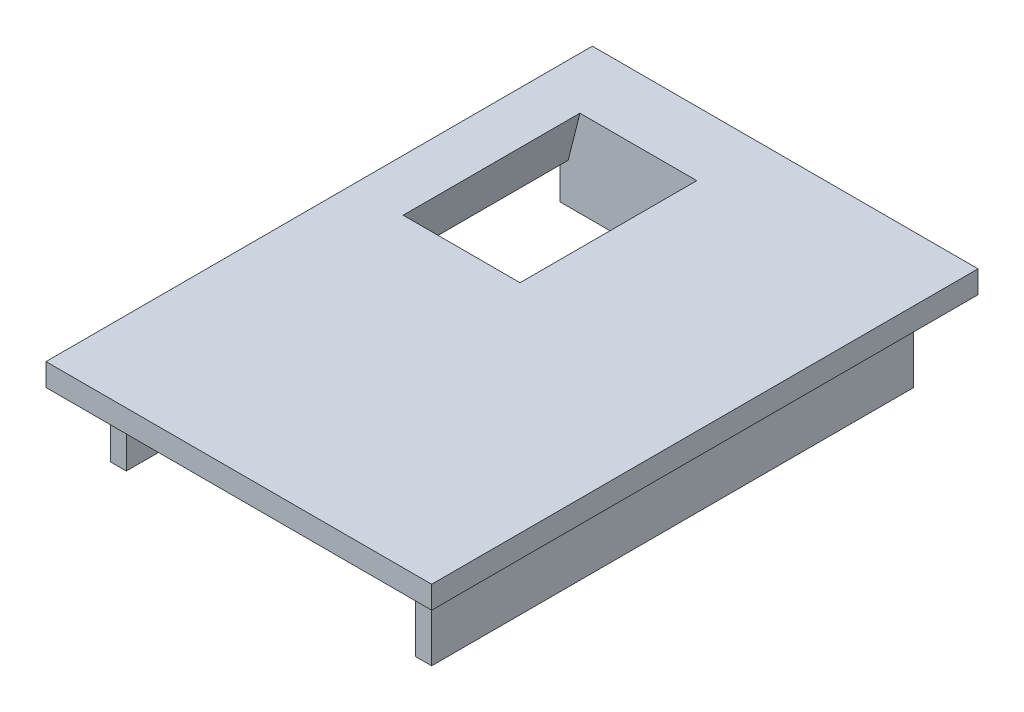
ISO-10303-21;
HEADER;
FILE_DESCRIPTION(('STEP AP214'),'2;1');
FILE_NAME('part.step','',(''),(''),'','','');
FILE_SCHEMA(('AUTOMOTIVE_DESIGN { 1 0 10303 214 1 1 1 1 }'));
ENDSEC;
DATA;
#1=APPLICATION_CONTEXT('core data for automotive mechanical design processes');
#2=APPLICATION_PROTOCOL_DEFINITION('international standard','automotive_design',2000,#1);
#3=PRODUCT_CONTEXT('',#1,'mechanical');
#4=PRODUCT('Part','Part','',(#3));
#5=PRODUCT_RELATED_PRODUCT_CATEGORY('part','',(#4));
#6=PRODUCT_DEFINITION_FORMATION('','',#4);
#7=PRODUCT_DEFINITION_CONTEXT('part definition',#1,'design');
#8=PRODUCT_DEFINITION('design','',#6,#7);
#9=PRODUCT_DEFINITION_SHAPE('','',#8);
#10=(LENGTH_UNIT() NAMED_UNIT(*) SI_UNIT(.MILLI.,.METRE.));
#11=(NAMED_UNIT(*) PLANE_ANGLE_UNIT() SI_UNIT($,.RADIAN.));
#12=(NAMED_UNIT(*) SI_UNIT($,.STERADIAN.) SOLID_ANGLE_UNIT());
#13=UNCERTAINTY_MEASURE_WITH_UNIT(LENGTH_MEASURE(1.E-05),#10,'distance_accuracy_value','');
#14=(GEOMETRIC_REPRESENTATION_CONTEXT(3) GLOBAL_UNCERTAINTY_ASSIGNED_CONTEXT((#13)) GLOBAL_UNIT_ASSIGNED_CONTEXT((#10,
#11,#12)) REPRESENTATION_CONTEXT('',''));
#15=CARTESIAN_POINT('',(0.,0.,0.));
#16=DIRECTION('',(0.,0.,1.));
#17=DIRECTION('',(1.,0.,0.));
#18=AXIS2_PLACEMENT_3D('',#15,#16,#17);
#19=CARTESIAN_POINT('',(0.,-4.,0.));
#20=DIRECTION('',(0.,1.,0.));
#21=DIRECTION('',(0.,0.,1.));
#22=AXIS2_PLACEMENT_3D('',#19,#20,#21);
#23=PLANE('',#22);
#24=DIRECTION('',(0.,0.,-1.));
#25=VECTOR('',#24,1.);
#26=CARTESIAN_POINT('',(8.,-4.,-15.));
#27=LINE('',#26,#25);
#28=CARTESIAN_POINT('',(8.,-4.,-13.));
#29=VERTEX_POINT('',#28);
#30=CARTESIAN_POINT('',(8.,-4.,-15.));
#31=VERTEX_POINT('',#30);
#32=EDGE_CURVE('E222',#29,#31,#27,.T.);
#33=ORIENTED_EDGE('',*,*,#32,.F.);
#34=DIRECTION('',(1.,0.,0.));
#35=VECTOR('',#34,1.);
#36=CARTESIAN_POINT('',(8.00000000000001,-4.,-13.));
#37=LINE('',#36,#35);
#38=CARTESIAN_POINT('',(-10.,-4.,-13.));
#39=VERTEX_POINT('',#38);
#40=EDGE_CURVE('E305',#39,#29,#37,.T.);
#41=ORIENTED_EDGE('',*,*,#40,.F.);
#42=DIRECTION('',(0.,0.,-1.));
#43=VECTOR('',#42,1.);
#44=CARTESIAN_POINT('',(-10.,-4.,-15.));
#45=LINE('',#44,#43);
#46=CARTESIAN_POINT('',(-10.,-4.,-15.));
#47=VERTEX_POINT('',#46);
#48=EDGE_CURVE('E331',#39,#47,#45,.T.);
#49=ORIENTED_EDGE('',*,*,#48,.T.);
#50=DIRECTION('',(1.,0.,0.));
#51=VECTOR('',#50,1.);
#52=CARTESIAN_POINT('',(-10.,-4.,-15.));
#53=LINE('',#52,#51);
#54=EDGE_CURVE('E336',#47,#31,#53,.T.);
#55=ORIENTED_EDGE('',*,*,#54,.T.);
#56=EDGE_LOOP('',(#33,#41,#49,#55));
#57=FACE_BOUND('',#56,.T.);
#58=ADVANCED_FACE('F35',(#57),#23,.F.);
#59=CARTESIAN_POINT('',(-10.,-4.,15.));
#60=VERTEX_POINT('',#59);
#61=CARTESIAN_POINT('',(-10.,-4.,-2.));
#62=VERTEX_POINT('',#61);
#63=EDGE_CURVE('E333',#60,#62,#45,.T.);
#64=ORIENTED_EDGE('',*,*,#63,.T.);
#65=DIRECTION('',(-1.,0.,0.));
#66=VECTOR('',#65,1.);
#67=CARTESIAN_POINT('',(3.28051417267847,-4.,-2.));
#68=LINE('',#67,#66);
#69=CARTESIAN_POINT('',(-8.,-4.,-2.));
#70=VERTEX_POINT('',#69);
#71=EDGE_CURVE('E255',#70,#62,#68,.T.);
#72=ORIENTED_EDGE('',*,*,#71,.F.);
#73=DIRECTION('',(0.,0.,-1.));
#74=VECTOR('',#73,1.);
#75=CARTESIAN_POINT('',(-8.,-4.,-13.));
#76=LINE('',#75,#74);
#77=CARTESIAN_POINT('',(-8.,-4.,13.));
#78=VERTEX_POINT('',#77);
#79=EDGE_CURVE('E303',#78,#70,#76,.T.);
#80=ORIENTED_EDGE('',*,*,#79,.F.);
#81=DIRECTION('',(1.,0.,0.));
#82=VECTOR('',#81,1.);
#83=CARTESIAN_POINT('',(9.,-4.,13.));
#84=LINE('',#83,#82);
#85=CARTESIAN_POINT('',(-9.,-4.,13.));
#86=VERTEX_POINT('',#85);
#87=EDGE_CURVE('E262',#86,#78,#84,.T.);
#88=ORIENTED_EDGE('',*,*,#87,.F.);
#89=DIRECTION('',(0.,0.,1.));
#90=VECTOR('',#89,1.);
#91=CARTESIAN_POINT('',(-9.,-4.,-5.24828759089465));
#92=LINE('',#91,#90);
#93=CARTESIAN_POINT('',(-9.,-4.,15.));
#94=VERTEX_POINT('',#93);
#95=EDGE_CURVE('E269',#86,#94,#92,.T.);
#96=ORIENTED_EDGE('',*,*,#95,.T.);
#97=DIRECTION('',(-1.,0.,0.));
#98=VECTOR('',#97,1.);
#99=CARTESIAN_POINT('',(-10.,-4.,15.));
#100=LINE('',#99,#98);
#101=EDGE_CURVE('E329',#94,#60,#100,.T.);
#102=ORIENTED_EDGE('',*,*,#101,.T.);
#103=EDGE_LOOP('',(#64,#72,#80,#88,#96,#102));
#104=FACE_BOUND('',#103,.T.);
#105=ADVANCED_FACE('F416',(#104),#23,.F.);
#106=CARTESIAN_POINT('',(0.,0.,0.));
#107=DIRECTION('',(0.,-1.,0.));
#108=DIRECTION('',(0.,0.,-1.));
#109=AXIS2_PLACEMENT_3D('',#106,#107,#108);
#110=PLANE('',#109);
#111=DIRECTION('',(0.,0.,-1.));
#112=VECTOR('',#111,1.);
#113=CARTESIAN_POINT('',(12.,0.,17.));
#114=LINE('',#113,#112);
#115=CARTESIAN_POINT('',(12.,0.,17.));
#116=VERTEX_POINT('',#115);
#117=CARTESIAN_POINT('',(12.,0.,-17.));
#118=VERTEX_POINT('',#117);
#119=EDGE_CURVE('E210',#116,#118,#114,.T.);
#120=ORIENTED_EDGE('',*,*,#119,.F.);
#121=DIRECTION('',(1.,0.,0.));
#122=VECTOR('',#121,1.);
#123=CARTESIAN_POINT('',(-12.,0.,17.));
#124=LINE('',#123,#122);
#125=CARTESIAN_POINT('',(-12.,0.,17.));
#126=VERTEX_POINT('',#125);
#127=EDGE_CURVE('E356',#126,#116,#124,.T.);
#128=ORIENTED_EDGE('',*,*,#127,.F.);
#129=DIRECTION('',(0.,0.,1.));
#130=VECTOR('',#129,1.);
#131=CARTESIAN_POINT('',(-12.,0.,17.));
#132=LINE('',#131,#130);
#133=CARTESIAN_POINT('',(-12.,0.,-17.));
#134=VERTEX_POINT('',#133);
#135=EDGE_CURVE('E367',#134,#126,#132,.T.);
#136=ORIENTED_EDGE('',*,*,#135,.F.);
#137=DIRECTION('',(-1.,0.,0.));
#138=VECTOR('',#137,1.);
#139=CARTESIAN_POINT('',(-12.,0.,-17.));
#140=LINE('',#139,#138);
#141=EDGE_CURVE('E365',#118,#134,#140,.T.);
#142=ORIENTED_EDGE('',*,*,#141,.F.);
#143=EDGE_LOOP('',(#120,#128,#136,#142));
#144=FACE_BOUND('',#143,.T.);
#145=DIRECTION('',(-1.,0.,0.));
#146=VECTOR('',#145,1.);
#147=CARTESIAN_POINT('',(-10.,0.,15.));
#148=LINE('',#147,#146);
#149=CARTESIAN_POINT('',(10.,0.,15.));
#150=VERTEX_POINT('',#149);
#151=CARTESIAN_POINT('',(-10.,0.,15.));
#152=VERTEX_POINT('',#151);
#153=EDGE_CURVE('E341',#150,#152,#148,.T.);
#154=ORIENTED_EDGE('',*,*,#153,.F.);
#155=DIRECTION('',(0.,0.,1.));
#156=VECTOR('',#155,1.);
#157=CARTESIAN_POINT('',(10.,0.,-15.));
#158=LINE('',#157,#156);
#159=CARTESIAN_POINT('',(10.,0.,-15.));
#160=VERTEX_POINT('',#159);
#161=EDGE_CURVE('E206',#160,#150,#158,.T.);
#162=ORIENTED_EDGE('',*,*,#161,.F.);
#163=DIRECTION('',(1.,0.,0.));
#164=VECTOR('',#163,1.);
#165=CARTESIAN_POINT('',(-10.,0.,-15.));
#166=LINE('',#165,#164);
#167=CARTESIAN_POINT('',(-10.,0.,-15.));
#168=VERTEX_POINT('',#167);
#169=EDGE_CURVE('E332',#168,#160,#166,.T.);
#170=ORIENTED_EDGE('',*,*,#169,.F.);
#171=DIRECTION('',(0.,0.,-1.));
#172=VECTOR('',#171,1.);
#173=CARTESIAN_POINT('',(-10.,0.,-15.));
#174=LINE('',#173,#172);
#175=EDGE_CURVE('E343',#152,#168,#174,.T.);
#176=ORIENTED_EDGE('',*,*,#175,.F.);
#177=EDGE_LOOP('',(#154,#162,#170,#176));
#178=FACE_BOUND('',#177,.T.);
#179=ADVANCED_FACE('F450',(#144,#178),#110,.T.);
#180=CARTESIAN_POINT('',(12.,1.4,17.));
#181=DIRECTION('',(-1.,0.,0.));
#182=DIRECTION('',(0.,0.,1.));
#183=AXIS2_PLACEMENT_3D('',#180,#181,#182);
#184=PLANE('',#183);
#185=ORIENTED_EDGE('',*,*,#119,.T.);
#186=DIRECTION('',(0.,-1.,0.));
#187=VECTOR('',#186,1.);
#188=CARTESIAN_POINT('',(12.,1.4,-17.));
#189=LINE('',#188,#187);
#190=CARTESIAN_POINT('',(12.,1.4,-17.));
#191=VERTEX_POINT('',#190);
#192=EDGE_CURVE('E378',#191,#118,#189,.T.);
#193=ORIENTED_EDGE('',*,*,#192,.F.);
#194=DIRECTION('',(0.,0.,-1.));
#195=VECTOR('',#194,1.);
#196=CARTESIAN_POINT('',(12.,1.4,17.));
#197=LINE('',#196,#195);
#198=CARTESIAN_POINT('',(12.,1.4,17.));
#199=VERTEX_POINT('',#198);
#200=EDGE_CURVE('E352',#199,#191,#197,.T.);
#201=ORIENTED_EDGE('',*,*,#200,.F.);
#202=DIRECTION('',(0.,-1.,0.));
#203=VECTOR('',#202,1.);
#204=CARTESIAN_POINT('',(12.,1.4,17.));
#205=LINE('',#204,#203);
#206=EDGE_CURVE('E362',#199,#116,#205,.T.);
#207=ORIENTED_EDGE('',*,*,#206,.T.);
#208=EDGE_LOOP('',(#185,#193,#201,#207));
#209=FACE_BOUND('',#208,.T.);
#210=ADVANCED_FACE('F503',(#209),#184,.F.);
#211=CARTESIAN_POINT('',(-12.,1.4,-17.));
#212=DIRECTION('',(0.,0.,1.));
#213=DIRECTION('',(1.,0.,0.));
#214=AXIS2_PLACEMENT_3D('',#211,#212,#213);
#215=PLANE('',#214);
#216=ORIENTED_EDGE('',*,*,#141,.T.);
#217=DIRECTION('',(0.,-1.,0.));
#218=VECTOR('',#217,1.);
#219=CARTESIAN_POINT('',(-12.,1.4,-17.));
#220=LINE('',#219,#218);
#221=CARTESIAN_POINT('',(-12.,1.4,-17.));
#222=VERTEX_POINT('',#221);
#223=EDGE_CURVE('E375',#222,#134,#220,.T.);
#224=ORIENTED_EDGE('',*,*,#223,.F.);
#225=DIRECTION('',(-1.,0.,0.));
#226=VECTOR('',#225,1.);
#227=CARTESIAN_POINT('',(-12.,1.4,-17.));
#228=LINE('',#227,#226);
#229=EDGE_CURVE('E355',#191,#222,#228,.T.);
#230=ORIENTED_EDGE('',*,*,#229,.F.);
#231=ORIENTED_EDGE('',*,*,#192,.T.);
#232=EDGE_LOOP('',(#216,#224,#230,#231));
#233=FACE_BOUND('',#232,.T.);
#234=ADVANCED_FACE('F500',(#233),#215,.F.);
#235=CARTESIAN_POINT('',(-12.,1.4,17.));
#236=DIRECTION('',(1.,0.,0.));
#237=DIRECTION('',(0.,0.,-1.));
#238=AXIS2_PLACEMENT_3D('',#235,#236,#237);
#239=PLANE('',#238);
#240=ORIENTED_EDGE('',*,*,#135,.T.);
#241=DIRECTION('',(0.,-1.,0.));
#242=VECTOR('',#241,1.);
#243=CARTESIAN_POINT('',(-12.,1.4,17.));
#244=LINE('',#243,#242);
#245=CARTESIAN_POINT('',(-12.,1.4,17.));
#246=VERTEX_POINT('',#245);
#247=EDGE_CURVE('E372',#246,#126,#244,.T.);
#248=ORIENTED_EDGE('',*,*,#247,.F.);
#249=DIRECTION('',(0.,0.,1.));
#250=VECTOR('',#249,1.);
#251=CARTESIAN_POINT('',(-12.,1.4,17.));
#252=LINE('',#251,#250);
#253=EDGE_CURVE('E358',#222,#246,#252,.T.);
#254=ORIENTED_EDGE('',*,*,#253,.F.);
#255=ORIENTED_EDGE('',*,*,#223,.T.);
#256=EDGE_LOOP('',(#240,#248,#254,#255));
#257=FACE_BOUND('',#256,.T.);
#258=ADVANCED_FACE('F496',(#257),#239,.F.);
#259=CARTESIAN_POINT('',(-12.,1.4,17.));
#260=DIRECTION('',(0.,0.,-1.));
#261=DIRECTION('',(-1.,0.,0.));
#262=AXIS2_PLACEMENT_3D('',#259,#260,#261);
#263=PLANE('',#262);
#264=ORIENTED_EDGE('',*,*,#127,.T.);
#265=ORIENTED_EDGE('',*,*,#206,.F.);
#266=DIRECTION('',(1.,0.,0.));
#267=VECTOR('',#266,1.);
#268=CARTESIAN_POINT('',(-12.,1.4,17.));
#269=LINE('',#268,#267);
#270=EDGE_CURVE('E360',#246,#199,#269,.T.);
#271=ORIENTED_EDGE('',*,*,#270,.F.);
#272=ORIENTED_EDGE('',*,*,#247,.T.);
#273=EDGE_LOOP('',(#264,#265,#271,#272));
#274=FACE_BOUND('',#273,.T.);
#275=ADVANCED_FACE('F491',(#274),#263,.F.);
#276=CARTESIAN_POINT('',(0.,1.4,0.));
#277=DIRECTION('',(0.,-1.,0.));
#278=DIRECTION('',(0.,0.,-1.));
#279=AXIS2_PLACEMENT_3D('',#276,#277,#278);
#280=PLANE('',#279);
#281=DIRECTION('',(0.,0.,-1.));
#282=VECTOR('',#281,1.);
#283=CARTESIAN_POINT('',(-8.77500000000003,1.4,-13.));
#284=LINE('',#283,#282);
#285=CARTESIAN_POINT('',(-8.77500000000003,1.4,-2.00000000000001));
#286=VERTEX_POINT('',#285);
#287=CARTESIAN_POINT('',(-8.77500000000003,1.4,-13.));
#288=VERTEX_POINT('',#287);
#289=EDGE_CURVE('E384',#286,#288,#284,.T.);
#290=ORIENTED_EDGE('',*,*,#289,.T.);
#291=DIRECTION('',(1.,0.,0.));
#292=VECTOR('',#291,1.);
#293=CARTESIAN_POINT('',(-1.5,1.4,-13.));
#294=LINE('',#293,#292);
#295=CARTESIAN_POINT('',(-1.5,1.4,-13.));
#296=VERTEX_POINT('',#295);
#297=EDGE_CURVE('E283',#288,#296,#294,.T.);
#298=ORIENTED_EDGE('',*,*,#297,.T.);
#299=DIRECTION('',(0.,0.,1.));
#300=VECTOR('',#299,1.);
#301=CARTESIAN_POINT('',(-1.5,1.4,-13.));
#302=LINE('',#301,#300);
#303=CARTESIAN_POINT('',(-1.5,1.4,-2.00000000000001));
#304=VERTEX_POINT('',#303);
#305=EDGE_CURVE('E286',#296,#304,#302,.T.);
#306=ORIENTED_EDGE('',*,*,#305,.T.);
#307=DIRECTION('',(-1.,0.,0.));
#308=VECTOR('',#307,1.);
#309=CARTESIAN_POINT('',(-1.5,1.4,-2.00000000000001));
#310=LINE('',#309,#308);
#311=CARTESIAN_POINT('',(-8.,1.4,-2.00000000000001));
#312=VERTEX_POINT('',#311);
#313=EDGE_CURVE('E290',#304,#312,#310,.T.);
#314=ORIENTED_EDGE('',*,*,#313,.T.);
#315=DIRECTION('',(-1.,0.,0.));
#316=VECTOR('',#315,1.);
#317=CARTESIAN_POINT('',(0.,1.4,-2.));
#318=LINE('',#317,#316);
#319=EDGE_CURVE('E50',#312,#286,#318,.T.);
#320=ORIENTED_EDGE('',*,*,#319,.T.);
#321=EDGE_LOOP('',(#290,#298,#306,#314,#320));
#322=FACE_BOUND('',#321,.T.);
#323=ORIENTED_EDGE('',*,*,#200,.T.);
#324=ORIENTED_EDGE('',*,*,#229,.T.);
#325=ORIENTED_EDGE('',*,*,#253,.T.);
#326=ORIENTED_EDGE('',*,*,#270,.T.);
#327=EDGE_LOOP('',(#323,#324,#325,#326));
#328=FACE_BOUND('',#327,.T.);
#329=ADVANCED_FACE('F405',(#322,#328),#280,.F.);
#330=CARTESIAN_POINT('',(10.,-4.,-15.));
#331=DIRECTION('',(-1.,0.,0.));
#332=DIRECTION('',(0.,0.,1.));
#333=AXIS2_PLACEMENT_3D('',#330,#331,#332);
#334=PLANE('',#333);
#335=ORIENTED_EDGE('',*,*,#161,.T.);
#336=DIRECTION('',(0.,1.,0.));
#337=VECTOR('',#336,1.);
#338=CARTESIAN_POINT('',(10.,-4.,15.));
#339=LINE('',#338,#337);
#340=CARTESIAN_POINT('',(10.,-5.,15.));
#341=VERTEX_POINT('',#340);
#342=EDGE_CURVE('E200',#341,#150,#339,.T.);
#343=ORIENTED_EDGE('',*,*,#342,.F.);
#344=DIRECTION('',(0.,0.,1.));
#345=VECTOR('',#344,1.);
#346=CARTESIAN_POINT('',(10.,-5.,-15.));
#347=LINE('',#346,#345);
#348=CARTESIAN_POINT('',(10.,-5.,-15.));
#349=VERTEX_POINT('',#348);
#350=EDGE_CURVE('E204',#349,#341,#347,.T.);
#351=ORIENTED_EDGE('',*,*,#350,.F.);
#352=DIRECTION('',(0.,1.,0.));
#353=VECTOR('',#352,1.);
#354=CARTESIAN_POINT('',(10.,-4.,-15.));
#355=LINE('',#354,#353);
#356=EDGE_CURVE('E339',#349,#160,#355,.T.);
#357=ORIENTED_EDGE('',*,*,#356,.T.);
#358=EDGE_LOOP('',(#335,#343,#351,#357));
#359=FACE_BOUND('',#358,.T.);
#360=ADVANCED_FACE('F202',(#359),#334,.F.);
#361=CARTESIAN_POINT('',(-10.,-4.,15.));
#362=DIRECTION('',(0.,0.,-1.));
#363=DIRECTION('',(-1.,0.,0.));
#364=AXIS2_PLACEMENT_3D('',#361,#362,#363);
#365=PLANE('',#364);
#366=DIRECTION('',(-1.,0.,0.));
#367=VECTOR('',#366,1.);
#368=CARTESIAN_POINT('',(-9.,-1.,15.));
#369=LINE('',#368,#367);
#370=CARTESIAN_POINT('',(9.,-0.999999999999997,15.));
#371=VERTEX_POINT('',#370);
#372=CARTESIAN_POINT('',(-9.,-1.,15.));
#373=VERTEX_POINT('',#372);
#374=EDGE_CURVE('E259',#371,#373,#369,.T.);
#375=ORIENTED_EDGE('',*,*,#374,.F.);
#376=DIRECTION('',(0.,1.,0.));
#377=VECTOR('',#376,1.);
#378=CARTESIAN_POINT('',(9.,-0.999999999999997,15.));
#379=LINE('',#378,#377);
#380=CARTESIAN_POINT('',(9.,-5.,15.));
#381=VERTEX_POINT('',#380);
#382=EDGE_CURVE('E227',#381,#371,#379,.T.);
#383=ORIENTED_EDGE('',*,*,#382,.F.);
#384=DIRECTION('',(-1.,0.,0.));
#385=VECTOR('',#384,1.);
#386=CARTESIAN_POINT('',(10.,-5.,15.));
#387=LINE('',#386,#385);
#388=EDGE_CURVE('E218',#341,#381,#387,.T.);
#389=ORIENTED_EDGE('',*,*,#388,.F.);
#390=ORIENTED_EDGE('',*,*,#342,.T.);
#391=ORIENTED_EDGE('',*,*,#153,.T.);
#392=DIRECTION('',(0.,1.,0.));
#393=VECTOR('',#392,1.);
#394=CARTESIAN_POINT('',(-10.,-4.,15.));
#395=LINE('',#394,#393);
#396=EDGE_CURVE('E211',#60,#152,#395,.T.);
#397=ORIENTED_EDGE('',*,*,#396,.F.);
#398=ORIENTED_EDGE('',*,*,#101,.F.);
#399=DIRECTION('',(0.,-1.,0.));
#400=VECTOR('',#399,1.);
#401=CARTESIAN_POINT('',(-9.,-4.,15.));
#402=LINE('',#401,#400);
#403=EDGE_CURVE('E258',#373,#94,#402,.T.);
#404=ORIENTED_EDGE('',*,*,#403,.F.);
#405=EDGE_LOOP('',(#375,#383,#389,#390,#391,#397,#398,#404));
#406=FACE_BOUND('',#405,.T.);
#407=ADVANCED_FACE('F225',(#406),#365,.F.);
#408=CARTESIAN_POINT('',(-10.,-4.,-15.));
#409=DIRECTION('',(1.,0.,0.));
#410=DIRECTION('',(0.,0.,-1.));
#411=AXIS2_PLACEMENT_3D('',#408,#409,#410);
#412=PLANE('',#411);
#413=DIRECTION('',(0.,0.,-1.));
#414=VECTOR('',#413,1.);
#415=CARTESIAN_POINT('',(-10.,-1.5,-13.));
#416=LINE('',#415,#414);
#417=CARTESIAN_POINT('',(-10.,-1.5,-2.));
#418=VERTEX_POINT('',#417);
#419=CARTESIAN_POINT('',(-10.,-1.5,-13.));
#420=VERTEX_POINT('',#419);
#421=EDGE_CURVE('E246',#418,#420,#416,.T.);
#422=ORIENTED_EDGE('',*,*,#421,.F.);
#423=DIRECTION('',(0.,1.,0.));
#424=VECTOR('',#423,1.);
#425=CARTESIAN_POINT('',(-10.,-1.5,-2.));
#426=LINE('',#425,#424);
#427=EDGE_CURVE('E242',#62,#418,#426,.T.);
#428=ORIENTED_EDGE('',*,*,#427,.F.);
#429=ORIENTED_EDGE('',*,*,#63,.F.);
#430=ORIENTED_EDGE('',*,*,#396,.T.);
#431=ORIENTED_EDGE('',*,*,#175,.T.);
#432=DIRECTION('',(0.,1.,0.));
#433=VECTOR('',#432,1.);
#434=CARTESIAN_POINT('',(-10.,-4.,-15.));
#435=LINE('',#434,#433);
#436=EDGE_CURVE('E348',#47,#168,#435,.T.);
#437=ORIENTED_EDGE('',*,*,#436,.F.);
#438=ORIENTED_EDGE('',*,*,#48,.F.);
#439=DIRECTION('',(0.,-1.,0.));
#440=VECTOR('',#439,1.);
#441=CARTESIAN_POINT('',(-10.,-4.,-13.));
#442=LINE('',#441,#440);
#443=EDGE_CURVE('E243',#420,#39,#442,.T.);
#444=ORIENTED_EDGE('',*,*,#443,.F.);
#445=EDGE_LOOP('',(#422,#428,#429,#430,#431,#437,#438,#444));
#446=FACE_BOUND('',#445,.T.);
#447=ADVANCED_FACE('F455',(#446),#412,.F.);
#448=CARTESIAN_POINT('',(-10.,-4.,-15.));
#449=DIRECTION('',(0.,0.,1.));
#450=DIRECTION('',(1.,0.,0.));
#451=AXIS2_PLACEMENT_3D('',#448,#449,#450);
#452=PLANE('',#451);
#453=ORIENTED_EDGE('',*,*,#169,.T.);
#454=ORIENTED_EDGE('',*,*,#356,.F.);
#455=DIRECTION('',(1.,0.,0.));
#456=VECTOR('',#455,1.);
#457=CARTESIAN_POINT('',(10.,-5.,-15.));
#458=LINE('',#457,#456);
#459=CARTESIAN_POINT('',(8.,-5.,-15.));
#460=VERTEX_POINT('',#459);
#461=EDGE_CURVE('E221',#460,#349,#458,.T.);
#462=ORIENTED_EDGE('',*,*,#461,.F.);
#463=DIRECTION('',(0.,1.,0.));
#464=VECTOR('',#463,1.);
#465=CARTESIAN_POINT('',(8.,-5.,-15.));
#466=LINE('',#465,#464);
#467=EDGE_CURVE('E238',#460,#31,#466,.T.);
#468=ORIENTED_EDGE('',*,*,#467,.T.);
#469=ORIENTED_EDGE('',*,*,#54,.F.);
#470=ORIENTED_EDGE('',*,*,#436,.T.);
#471=EDGE_LOOP('',(#453,#454,#462,#468,#469,#470));
#472=FACE_BOUND('',#471,.T.);
#473=ADVANCED_FACE('F447',(#472),#452,.F.);
#474=CARTESIAN_POINT('',(-8.,-4.,-13.));
#475=DIRECTION('',(1.,0.,0.));
#476=DIRECTION('',(0.,0.,-1.));
#477=AXIS2_PLACEMENT_3D('',#474,#475,#476);
#478=PLANE('',#477);
#479=DIRECTION('',(0.,1.,0.));
#480=VECTOR('',#479,1.);
#481=CARTESIAN_POINT('',(-8.,-1.5,-2.));
#482=LINE('',#481,#480);
#483=CARTESIAN_POINT('',(-8.,0.,-2.00000000000001));
#484=VERTEX_POINT('',#483);
#485=EDGE_CURVE('E58',#70,#484,#482,.T.);
#486=ORIENTED_EDGE('',*,*,#485,.T.);
#487=DIRECTION('',(0.,0.,-1.));
#488=VECTOR('',#487,1.);
#489=CARTESIAN_POINT('',(-8.,0.,-13.));
#490=LINE('',#489,#488);
#491=CARTESIAN_POINT('',(-8.,0.,13.));
#492=VERTEX_POINT('',#491);
#493=EDGE_CURVE('E298',#492,#484,#490,.T.);
#494=ORIENTED_EDGE('',*,*,#493,.F.);
#495=DIRECTION('',(0.,1.,0.));
#496=VECTOR('',#495,1.);
#497=CARTESIAN_POINT('',(-8.,-4.,13.));
#498=LINE('',#497,#496);
#499=CARTESIAN_POINT('',(-8.,-0.999999999999998,13.));
#500=VERTEX_POINT('',#499);
#501=EDGE_CURVE('E309',#500,#492,#498,.T.);
#502=ORIENTED_EDGE('',*,*,#501,.F.);
#503=EDGE_CURVE('E319',#78,#500,#498,.T.);
#504=ORIENTED_EDGE('',*,*,#503,.F.);
#505=ORIENTED_EDGE('',*,*,#79,.T.);
#506=EDGE_LOOP('',(#486,#494,#502,#504,#505));
#507=FACE_BOUND('',#506,.T.);
#508=ADVANCED_FACE('F420',(#507),#478,.T.);
#509=CARTESIAN_POINT('',(8.00000000000001,-4.,-13.));
#510=DIRECTION('',(0.,0.,1.));
#511=DIRECTION('',(1.,0.,0.));
#512=AXIS2_PLACEMENT_3D('',#509,#510,#511);
#513=PLANE('',#512);
#514=DIRECTION('',(1.,0.,0.));
#515=VECTOR('',#514,1.);
#516=CARTESIAN_POINT('',(8.00000000000001,0.,-13.));
#517=LINE('',#516,#515);
#518=CARTESIAN_POINT('',(-1.5,0.,-13.));
#519=VERTEX_POINT('',#518);
#520=CARTESIAN_POINT('',(8.00000000000001,0.,-13.));
#521=VERTEX_POINT('',#520);
#522=EDGE_CURVE('E312',#519,#521,#517,.T.);
#523=ORIENTED_EDGE('',*,*,#522,.F.);
#524=DIRECTION('',(0.,-1.,0.));
#525=VECTOR('',#524,1.);
#526=CARTESIAN_POINT('',(-1.5,1.4,-13.));
#527=LINE('',#526,#525);
#528=EDGE_CURVE('E292',#296,#519,#527,.T.);
#529=ORIENTED_EDGE('',*,*,#528,.F.);
#530=ORIENTED_EDGE('',*,*,#297,.F.);
#531=DIRECTION('',(-0.242535625036339,-0.97014250014533,0.));
#532=VECTOR('',#531,1.);
#533=CARTESIAN_POINT('',(-8.,4.50000000000001,-13.));
#534=LINE('',#533,#532);
#535=CARTESIAN_POINT('',(-9.50000000000005,-1.5,-13.));
#536=VERTEX_POINT('',#535);
#537=EDGE_CURVE('E44',#288,#536,#534,.T.);
#538=ORIENTED_EDGE('',*,*,#537,.T.);
#539=DIRECTION('',(-1.,0.,0.));
#540=VECTOR('',#539,1.);
#541=CARTESIAN_POINT('',(3.28051417267847,-1.5,-13.));
#542=LINE('',#541,#540);
#543=EDGE_CURVE('E253',#536,#420,#542,.T.);
#544=ORIENTED_EDGE('',*,*,#543,.T.);
#545=ORIENTED_EDGE('',*,*,#443,.T.);
#546=ORIENTED_EDGE('',*,*,#40,.T.);
#547=DIRECTION('',(0.,1.,0.));
#548=VECTOR('',#547,1.);
#549=CARTESIAN_POINT('',(8.00000000000001,-4.,-13.));
#550=LINE('',#549,#548);
#551=EDGE_CURVE('E326',#29,#521,#550,.T.);
#552=ORIENTED_EDGE('',*,*,#551,.T.);
#553=EDGE_LOOP('',(#523,#529,#530,#538,#544,#545,#546,#552));
#554=FACE_BOUND('',#553,.T.);
#555=ADVANCED_FACE('F393',(#554),#513,.T.);
#556=CARTESIAN_POINT('',(8.,-4.,13.));
#557=DIRECTION('',(-1.,0.,0.));
#558=DIRECTION('',(0.,0.,1.));
#559=AXIS2_PLACEMENT_3D('',#556,#557,#558);
#560=PLANE('',#559);
#561=DIRECTION('',(0.,0.,1.));
#562=VECTOR('',#561,1.);
#563=CARTESIAN_POINT('',(8.,0.,13.));
#564=LINE('',#563,#562);
#565=CARTESIAN_POINT('',(8.,0.,13.));
#566=VERTEX_POINT('',#565);
#567=EDGE_CURVE('E314',#521,#566,#564,.T.);
#568=ORIENTED_EDGE('',*,*,#567,.F.);
#569=ORIENTED_EDGE('',*,*,#551,.F.);
#570=ORIENTED_EDGE('',*,*,#32,.T.);
#571=ORIENTED_EDGE('',*,*,#467,.F.);
#572=DIRECTION('',(0.,0.,-1.));
#573=VECTOR('',#572,1.);
#574=CARTESIAN_POINT('',(8.,-5.,-15.));
#575=LINE('',#574,#573);
#576=CARTESIAN_POINT('',(8.,-5.,13.));
#577=VERTEX_POINT('',#576);
#578=EDGE_CURVE('E235',#577,#460,#575,.T.);
#579=ORIENTED_EDGE('',*,*,#578,.F.);
#580=DIRECTION('',(0.,1.,0.));
#581=VECTOR('',#580,1.);
#582=CARTESIAN_POINT('',(8.,-4.,13.));
#583=LINE('',#582,#581);
#584=CARTESIAN_POINT('',(8.,-0.999999999999997,13.));
#585=VERTEX_POINT('',#584);
#586=EDGE_CURVE('E323',#577,#585,#583,.T.);
#587=ORIENTED_EDGE('',*,*,#586,.T.);
#588=EDGE_CURVE('E322',#585,#566,#583,.T.);
#589=ORIENTED_EDGE('',*,*,#588,.T.);
#590=EDGE_LOOP('',(#568,#569,#570,#571,#579,#587,#589));
#591=FACE_BOUND('',#590,.T.);
#592=ADVANCED_FACE('F443',(#591),#560,.T.);
#593=CARTESIAN_POINT('',(-8.,-4.,13.));
#594=DIRECTION('',(0.,0.,-1.));
#595=DIRECTION('',(-1.,0.,0.));
#596=AXIS2_PLACEMENT_3D('',#593,#594,#595);
#597=PLANE('',#596);
#598=DIRECTION('',(1.,0.,0.));
#599=VECTOR('',#598,1.);
#600=CARTESIAN_POINT('',(-8.,-1.,13.));
#601=LINE('',#600,#599);
#602=EDGE_CURVE('E381',#500,#585,#601,.T.);
#603=ORIENTED_EDGE('',*,*,#602,.F.);
#604=ORIENTED_EDGE('',*,*,#501,.T.);
#605=DIRECTION('',(-1.,0.,0.));
#606=VECTOR('',#605,1.);
#607=CARTESIAN_POINT('',(-8.,0.,13.));
#608=LINE('',#607,#606);
#609=EDGE_CURVE('E306',#566,#492,#608,.T.);
#610=ORIENTED_EDGE('',*,*,#609,.F.);
#611=ORIENTED_EDGE('',*,*,#588,.F.);
#612=EDGE_LOOP('',(#603,#604,#610,#611));
#613=FACE_BOUND('',#612,.T.);
#614=ADVANCED_FACE('F428',(#613),#597,.T.);
#615=DIRECTION('',(0.,0.,1.));
#616=VECTOR('',#615,1.);
#617=CARTESIAN_POINT('',(-1.5,0.,-13.));
#618=LINE('',#617,#616);
#619=CARTESIAN_POINT('',(-1.5,0.,-2.00000000000001));
#620=VERTEX_POINT('',#619);
#621=EDGE_CURVE('E282',#519,#620,#618,.T.);
#622=ORIENTED_EDGE('',*,*,#621,.F.);
#623=ORIENTED_EDGE('',*,*,#522,.T.);
#624=ORIENTED_EDGE('',*,*,#567,.T.);
#625=ORIENTED_EDGE('',*,*,#609,.T.);
#626=ORIENTED_EDGE('',*,*,#493,.T.);
#627=DIRECTION('',(-1.,0.,0.));
#628=VECTOR('',#627,1.);
#629=CARTESIAN_POINT('',(-1.5,0.,-2.00000000000001));
#630=LINE('',#629,#628);
#631=EDGE_CURVE('E287',#620,#484,#630,.T.);
#632=ORIENTED_EDGE('',*,*,#631,.F.);
#633=EDGE_LOOP('',(#622,#623,#624,#625,#626,#632));
#634=FACE_BOUND('',#633,.T.);
#635=ADVANCED_FACE('F461',(#634),#110,.T.);
#636=CARTESIAN_POINT('',(-1.5,1.4,-2.00000000000001));
#637=DIRECTION('',(0.,0.,1.));
#638=DIRECTION('',(1.,0.,0.));
#639=AXIS2_PLACEMENT_3D('',#636,#637,#638);
#640=PLANE('',#639);
#641=ORIENTED_EDGE('',*,*,#631,.T.);
#642=DIRECTION('',(0.,-1.,0.));
#643=VECTOR('',#642,1.);
#644=CARTESIAN_POINT('',(-8.,1.4,-2.00000000000001));
#645=LINE('',#644,#643);
#646=EDGE_CURVE('E296',#312,#484,#645,.T.);
#647=ORIENTED_EDGE('',*,*,#646,.F.);
#648=ORIENTED_EDGE('',*,*,#313,.F.);
#649=DIRECTION('',(0.,-1.,0.));
#650=VECTOR('',#649,1.);
#651=CARTESIAN_POINT('',(-1.5,1.4,-2.00000000000001));
#652=LINE('',#651,#650);
#653=EDGE_CURVE('E299',#304,#620,#652,.T.);
#654=ORIENTED_EDGE('',*,*,#653,.T.);
#655=EDGE_LOOP('',(#641,#647,#648,#654));
#656=FACE_BOUND('',#655,.T.);
#657=ADVANCED_FACE('F410',(#656),#640,.F.);
#658=CARTESIAN_POINT('',(-1.5,1.4,-13.));
#659=DIRECTION('',(1.,0.,0.));
#660=DIRECTION('',(0.,0.,-1.));
#661=AXIS2_PLACEMENT_3D('',#658,#659,#660);
#662=PLANE('',#661);
#663=ORIENTED_EDGE('',*,*,#621,.T.);
#664=ORIENTED_EDGE('',*,*,#653,.F.);
#665=ORIENTED_EDGE('',*,*,#305,.F.);
#666=ORIENTED_EDGE('',*,*,#528,.T.);
#667=EDGE_LOOP('',(#663,#664,#665,#666));
#668=FACE_BOUND('',#667,.T.);
#669=ADVANCED_FACE('F463',(#668),#662,.F.);
#670=CARTESIAN_POINT('',(-8.,-4.,13.));
#671=DIRECTION('',(0.,0.,-1.));
#672=DIRECTION('',(-1.,0.,0.));
#673=AXIS2_PLACEMENT_3D('',#670,#671,#672);
#674=PLANE('',#673);
#675=ORIENTED_EDGE('',*,*,#503,.T.);
#676=DIRECTION('',(-1.,0.,0.));
#677=VECTOR('',#676,1.);
#678=CARTESIAN_POINT('',(-9.,-1.,13.));
#679=LINE('',#678,#677);
#680=CARTESIAN_POINT('',(-9.,-1.,13.));
#681=VERTEX_POINT('',#680);
#682=EDGE_CURVE('E274',#500,#681,#679,.T.);
#683=ORIENTED_EDGE('',*,*,#682,.T.);
#684=DIRECTION('',(0.,-1.,0.));
#685=VECTOR('',#684,1.);
#686=CARTESIAN_POINT('',(-9.,-4.,13.));
#687=LINE('',#686,#685);
#688=EDGE_CURVE('E267',#681,#86,#687,.T.);
#689=ORIENTED_EDGE('',*,*,#688,.T.);
#690=ORIENTED_EDGE('',*,*,#87,.T.);
#691=EDGE_LOOP('',(#675,#683,#689,#690));
#692=FACE_BOUND('',#691,.T.);
#693=ADVANCED_FACE('F424',(#692),#674,.F.);
#694=ORIENTED_EDGE('',*,*,#586,.F.);
#695=DIRECTION('',(-1.,0.,0.));
#696=VECTOR('',#695,1.);
#697=CARTESIAN_POINT('',(9.,-5.,13.));
#698=LINE('',#697,#696);
#699=CARTESIAN_POINT('',(9.,-5.,13.));
#700=VERTEX_POINT('',#699);
#701=EDGE_CURVE('E230',#700,#577,#698,.T.);
#702=ORIENTED_EDGE('',*,*,#701,.F.);
#703=DIRECTION('',(0.,1.,0.));
#704=VECTOR('',#703,1.);
#705=CARTESIAN_POINT('',(9.,-0.999999999999997,13.));
#706=LINE('',#705,#704);
#707=CARTESIAN_POINT('',(9.,-0.999999999999997,13.));
#708=VERTEX_POINT('',#707);
#709=EDGE_CURVE('E266',#700,#708,#706,.T.);
#710=ORIENTED_EDGE('',*,*,#709,.T.);
#711=EDGE_CURVE('E271',#708,#585,#679,.T.);
#712=ORIENTED_EDGE('',*,*,#711,.T.);
#713=EDGE_LOOP('',(#694,#702,#710,#712));
#714=FACE_BOUND('',#713,.T.);
#715=ADVANCED_FACE('F435',(#714),#674,.F.);
#716=CARTESIAN_POINT('',(9.,-0.999999999999997,-5.24828759089465));
#717=DIRECTION('',(1.,0.,0.));
#718=DIRECTION('',(0.,0.,-1.));
#719=AXIS2_PLACEMENT_3D('',#716,#717,#718);
#720=PLANE('',#719);
#721=ORIENTED_EDGE('',*,*,#709,.F.);
#722=DIRECTION('',(0.,0.,-1.));
#723=VECTOR('',#722,1.);
#724=CARTESIAN_POINT('',(9.,-5.,15.));
#725=LINE('',#724,#723);
#726=EDGE_CURVE('E228',#381,#700,#725,.T.);
#727=ORIENTED_EDGE('',*,*,#726,.F.);
#728=ORIENTED_EDGE('',*,*,#382,.T.);
#729=DIRECTION('',(0.,0.,1.));
#730=VECTOR('',#729,1.);
#731=CARTESIAN_POINT('',(9.,-0.999999999999997,-5.24828759089465));
#732=LINE('',#731,#730);
#733=EDGE_CURVE('E277',#708,#371,#732,.T.);
#734=ORIENTED_EDGE('',*,*,#733,.F.);
#735=EDGE_LOOP('',(#721,#727,#728,#734));
#736=FACE_BOUND('',#735,.T.);
#737=ADVANCED_FACE('F438',(#736),#720,.F.);
#738=CARTESIAN_POINT('',(-9.,-1.,-5.24828759089465));
#739=DIRECTION('',(0.,1.,0.));
#740=DIRECTION('',(-1.,0.,0.));
#741=AXIS2_PLACEMENT_3D('',#738,#739,#740);
#742=PLANE('',#741);
#743=ORIENTED_EDGE('',*,*,#733,.T.);
#744=ORIENTED_EDGE('',*,*,#374,.T.);
#745=DIRECTION('',(0.,0.,1.));
#746=VECTOR('',#745,1.);
#747=CARTESIAN_POINT('',(-9.,-1.,-5.24828759089465));
#748=LINE('',#747,#746);
#749=EDGE_CURVE('E270',#681,#373,#748,.T.);
#750=ORIENTED_EDGE('',*,*,#749,.F.);
#751=ORIENTED_EDGE('',*,*,#682,.F.);
#752=ORIENTED_EDGE('',*,*,#602,.T.);
#753=ORIENTED_EDGE('',*,*,#711,.F.);
#754=EDGE_LOOP('',(#743,#744,#750,#751,#752,#753));
#755=FACE_BOUND('',#754,.T.);
#756=ADVANCED_FACE('F431',(#755),#742,.F.);
#757=CARTESIAN_POINT('',(-9.,-4.,-5.24828759089465));
#758=DIRECTION('',(-1.,0.,0.));
#759=DIRECTION('',(0.,0.,1.));
#760=AXIS2_PLACEMENT_3D('',#757,#758,#759);
#761=PLANE('',#760);
#762=ORIENTED_EDGE('',*,*,#749,.T.);
#763=ORIENTED_EDGE('',*,*,#403,.T.);
#764=ORIENTED_EDGE('',*,*,#95,.F.);
#765=ORIENTED_EDGE('',*,*,#688,.F.);
#766=EDGE_LOOP('',(#762,#763,#764,#765));
#767=FACE_BOUND('',#766,.T.);
#768=ADVANCED_FACE('F536',(#767),#761,.F.);
#769=CARTESIAN_POINT('',(3.28051417267847,-1.5,-2.));
#770=DIRECTION('',(0.,0.,1.));
#771=DIRECTION('',(1.,0.,0.));
#772=AXIS2_PLACEMENT_3D('',#769,#770,#771);
#773=PLANE('',#772);
#774=ORIENTED_EDGE('',*,*,#71,.T.);
#775=ORIENTED_EDGE('',*,*,#427,.T.);
#776=DIRECTION('',(-1.,0.,0.));
#777=VECTOR('',#776,1.);
#778=CARTESIAN_POINT('',(3.28051417267847,-1.5,-2.));
#779=LINE('',#778,#777);
#780=CARTESIAN_POINT('',(-9.50000000000005,-1.5,-2.));
#781=VERTEX_POINT('',#780);
#782=EDGE_CURVE('E252',#781,#418,#779,.T.);
#783=ORIENTED_EDGE('',*,*,#782,.F.);
#784=DIRECTION('',(0.242535625036339,0.97014250014533,0.));
#785=VECTOR('',#784,1.);
#786=CARTESIAN_POINT('',(-8.74820504866598,1.50717980533619,-2.));
#787=LINE('',#786,#785);
#788=EDGE_CURVE('E11',#781,#286,#787,.T.);
#789=ORIENTED_EDGE('',*,*,#788,.T.);
#790=ORIENTED_EDGE('',*,*,#319,.F.);
#791=ORIENTED_EDGE('',*,*,#646,.T.);
#792=ORIENTED_EDGE('',*,*,#485,.F.);
#793=EDGE_LOOP('',(#774,#775,#783,#789,#790,#791,#792));
#794=FACE_BOUND('',#793,.T.);
#795=ADVANCED_FACE('F403',(#794),#773,.F.);
#796=CARTESIAN_POINT('',(3.28051417267847,-1.5,-13.));
#797=DIRECTION('',(0.,1.,0.));
#798=DIRECTION('',(0.,0.,1.));
#799=AXIS2_PLACEMENT_3D('',#796,#797,#798);
#800=PLANE('',#799);
#801=ORIENTED_EDGE('',*,*,#543,.F.);
#802=DIRECTION('',(0.,0.,1.));
#803=VECTOR('',#802,1.);
#804=CARTESIAN_POINT('',(-9.50000000000005,-1.5,-2.));
#805=LINE('',#804,#803);
#806=EDGE_CURVE('E387',#536,#781,#805,.T.);
#807=ORIENTED_EDGE('',*,*,#806,.T.);
#808=ORIENTED_EDGE('',*,*,#782,.T.);
#809=ORIENTED_EDGE('',*,*,#421,.T.);
#810=EDGE_LOOP('',(#801,#807,#808,#809));
#811=FACE_BOUND('',#810,.T.);
#812=ADVANCED_FACE('F399',(#811),#800,.F.);
#813=CARTESIAN_POINT('',(-8.,4.50000000000001,-13.));
#814=DIRECTION('',(0.97014250014533,-0.242535625036339,0.));
#815=DIRECTION('',(0.,0.,1.));
#816=AXIS2_PLACEMENT_3D('',#813,#814,#815);
#817=PLANE('',#816);
#818=ORIENTED_EDGE('',*,*,#788,.F.);
#819=ORIENTED_EDGE('',*,*,#806,.F.);
#820=ORIENTED_EDGE('',*,*,#537,.F.);
#821=ORIENTED_EDGE('',*,*,#289,.F.);
#822=EDGE_LOOP('',(#818,#819,#820,#821));
#823=FACE_BOUND('',#822,.T.);
#824=ADVANCED_FACE('F38',(#823),#817,.T.);
#825=CARTESIAN_POINT('',(0.,-5.,0.));
#826=DIRECTION('',(0.,-1.,0.));
#827=DIRECTION('',(0.,0.,-1.));
#828=AXIS2_PLACEMENT_3D('',#825,#826,#827);
#829=PLANE('',#828);
#830=ORIENTED_EDGE('',*,*,#350,.T.);
#831=ORIENTED_EDGE('',*,*,#388,.T.);
#832=ORIENTED_EDGE('',*,*,#726,.T.);
#833=ORIENTED_EDGE('',*,*,#701,.T.);
#834=ORIENTED_EDGE('',*,*,#578,.T.);
#835=ORIENTED_EDGE('',*,*,#461,.T.);
#836=EDGE_LOOP('',(#830,#831,#832,#833,#834,#835));
#837=FACE_BOUND('',#836,.T.);
#838=ADVANCED_FACE('F216',(#837),#829,.T.);
#839=CLOSED_SHELL('',(#58,#105,#179,#210,#234,#258,#275,#329,#360,#407,#447,#473,#508,#555,#592,
#614,#635,#657,#669,#693,#715,#737,#756,#768,#795,#812,#824,#838));
#840=MANIFOLD_SOLID_BREP('B2',#839);
#841=ADVANCED_BREP_SHAPE_REPRESENTATION('',(#18,#840),#14);
#842=SHAPE_DEFINITION_REPRESENTATION(#9,#841);
ENDSEC;
END-ISO-10303-21;
